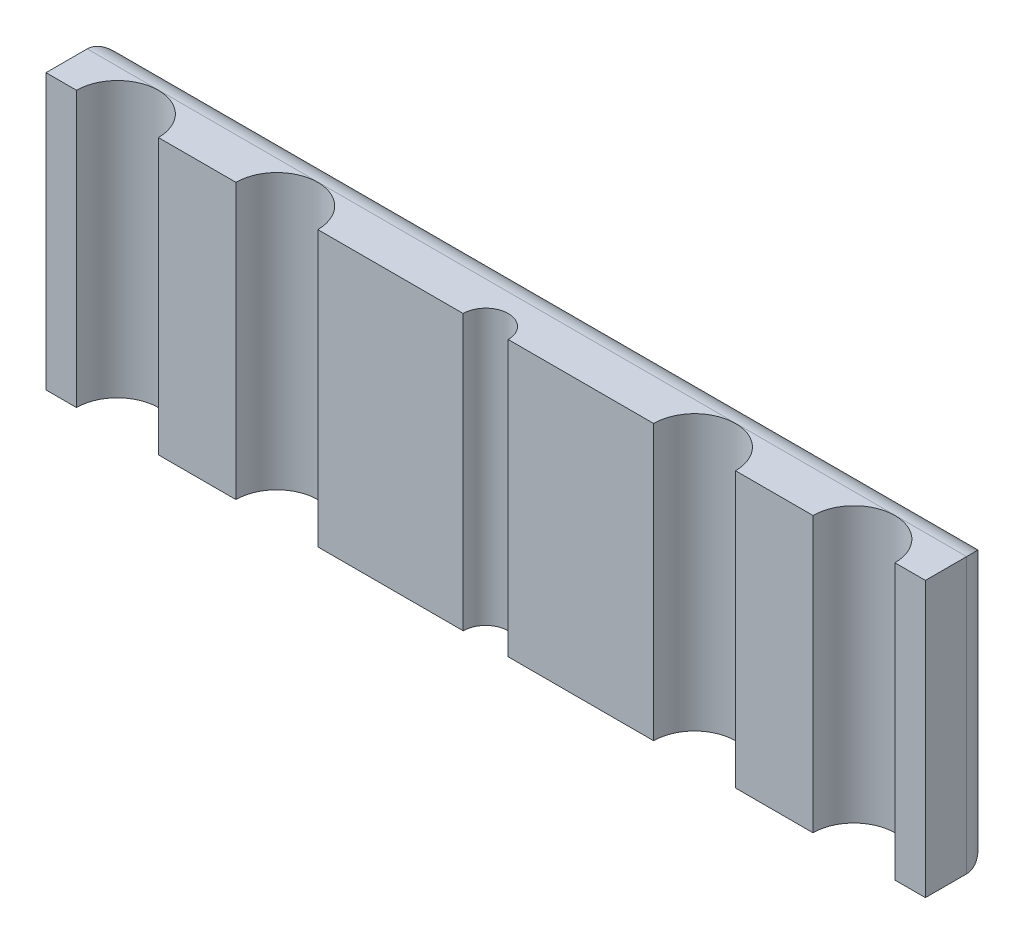
ISO-10303-21;
HEADER;
FILE_DESCRIPTION(('STEP AP214'),'2;1');
FILE_NAME('part.step','',(''),(''),'','','');
FILE_SCHEMA(('AUTOMOTIVE_DESIGN { 1 0 10303 214 1 1 1 1 }'));
ENDSEC;
DATA;
#1=APPLICATION_CONTEXT('core data for automotive mechanical design processes');
#2=APPLICATION_PROTOCOL_DEFINITION('international standard','automotive_design',2000,#1);
#3=PRODUCT_CONTEXT('',#1,'mechanical');
#4=PRODUCT('Part','Part','',(#3));
#5=PRODUCT_RELATED_PRODUCT_CATEGORY('part','',(#4));
#6=PRODUCT_DEFINITION_FORMATION('','',#4);
#7=PRODUCT_DEFINITION_CONTEXT('part definition',#1,'design');
#8=PRODUCT_DEFINITION('design','',#6,#7);
#9=PRODUCT_DEFINITION_SHAPE('','',#8);
#10=(LENGTH_UNIT() NAMED_UNIT(*) SI_UNIT(.MILLI.,.METRE.));
#11=(NAMED_UNIT(*) PLANE_ANGLE_UNIT() SI_UNIT($,.RADIAN.));
#12=(NAMED_UNIT(*) SI_UNIT($,.STERADIAN.) SOLID_ANGLE_UNIT());
#13=UNCERTAINTY_MEASURE_WITH_UNIT(LENGTH_MEASURE(1.E-05),#10,'distance_accuracy_value','');
#14=(GEOMETRIC_REPRESENTATION_CONTEXT(3) GLOBAL_UNCERTAINTY_ASSIGNED_CONTEXT((#13)) GLOBAL_UNIT_ASSIGNED_CONTEXT((#10,
#11,#12)) REPRESENTATION_CONTEXT('',''));
#15=CARTESIAN_POINT('',(0.,0.,0.));
#16=DIRECTION('',(0.,0.,1.));
#17=DIRECTION('',(1.,0.,0.));
#18=AXIS2_PLACEMENT_3D('',#15,#16,#17);
#19=CARTESIAN_POINT('',(0.,0.,12.5));
#20=DIRECTION('',(0.,0.,-1.));
#21=DIRECTION('',(-1.,0.,0.));
#22=AXIS2_PLACEMENT_3D('',#19,#20,#21);
#23=PLANE('',#22);
#24=DIRECTION('',(1.,0.,0.));
#25=VECTOR('',#24,1.);
#26=CARTESIAN_POINT('',(0.,-50.,12.5));
#27=LINE('',#26,#25);
#28=CARTESIAN_POINT('',(-160.,-50.,12.5));
#29=VERTEX_POINT('',#28);
#30=CARTESIAN_POINT('',(-154.45,-50.,12.5));
#31=VERTEX_POINT('',#30);
#32=EDGE_CURVE('E203',#29,#31,#27,.T.);
#33=ORIENTED_EDGE('',*,*,#32,.T.);
#34=DIRECTION('',(0.,1.,0.));
#35=VECTOR('',#34,1.);
#36=CARTESIAN_POINT('',(-154.45,-50.,12.5));
#37=LINE('',#36,#35);
#38=CARTESIAN_POINT('',(-154.45,0.,12.5));
#39=VERTEX_POINT('',#38);
#40=EDGE_CURVE('E248',#31,#39,#37,.T.);
#41=ORIENTED_EDGE('',*,*,#40,.T.);
#42=DIRECTION('',(-1.,0.,0.));
#43=VECTOR('',#42,1.);
#44=CARTESIAN_POINT('',(0.,0.,12.5));
#45=LINE('',#44,#43);
#46=CARTESIAN_POINT('',(-160.,0.,12.5));
#47=VERTEX_POINT('',#46);
#48=EDGE_CURVE('E191',#39,#47,#45,.T.);
#49=ORIENTED_EDGE('',*,*,#48,.T.);
#50=DIRECTION('',(0.,-1.,0.));
#51=VECTOR('',#50,1.);
#52=CARTESIAN_POINT('',(-160.,0.,12.5));
#53=LINE('',#52,#51);
#54=EDGE_CURVE('E197',#47,#29,#53,.T.);
#55=ORIENTED_EDGE('',*,*,#54,.T.);
#56=EDGE_LOOP('',(#33,#41,#49,#55));
#57=FACE_BOUND('',#56,.T.);
#58=ADVANCED_FACE('F39',(#57),#23,.F.);
#59=CARTESIAN_POINT('',(-110.55,-50.,12.5));
#60=VERTEX_POINT('',#59);
#61=CARTESIAN_POINT('',(-84.1,-50.,12.5));
#62=VERTEX_POINT('',#61);
#63=EDGE_CURVE('E383',#60,#62,#27,.T.);
#64=ORIENTED_EDGE('',*,*,#63,.T.);
#65=DIRECTION('',(0.,1.,0.));
#66=VECTOR('',#65,1.);
#67=CARTESIAN_POINT('',(-84.1,-50.,12.5));
#68=LINE('',#67,#66);
#69=CARTESIAN_POINT('',(-84.1,0.,12.5));
#70=VERTEX_POINT('',#69);
#71=EDGE_CURVE('E183',#62,#70,#68,.T.);
#72=ORIENTED_EDGE('',*,*,#71,.T.);
#73=CARTESIAN_POINT('',(-110.55,0.,12.5));
#74=VERTEX_POINT('',#73);
#75=EDGE_CURVE('E174',#70,#74,#45,.T.);
#76=ORIENTED_EDGE('',*,*,#75,.T.);
#77=DIRECTION('',(0.,1.,0.));
#78=VECTOR('',#77,1.);
#79=CARTESIAN_POINT('',(-110.55,-50.,12.5));
#80=LINE('',#79,#78);
#81=EDGE_CURVE('E155',#74,#60,#80,.F.);
#82=ORIENTED_EDGE('',*,*,#81,.T.);
#83=EDGE_LOOP('',(#64,#72,#76,#82));
#84=FACE_BOUND('',#83,.T.);
#85=ADVANCED_FACE('F182',(#84),#23,.F.);
#86=CARTESIAN_POINT('',(-49.45,0.,12.5));
#87=VERTEX_POINT('',#86);
#88=CARTESIAN_POINT('',(-75.9,0.,12.5));
#89=VERTEX_POINT('',#88);
#90=EDGE_CURVE('E185',#87,#89,#45,.T.);
#91=ORIENTED_EDGE('',*,*,#90,.T.);
#92=DIRECTION('',(0.,1.,0.));
#93=VECTOR('',#92,1.);
#94=CARTESIAN_POINT('',(-75.9,-50.,12.5));
#95=LINE('',#94,#93);
#96=CARTESIAN_POINT('',(-75.9,-50.,12.5));
#97=VERTEX_POINT('',#96);
#98=EDGE_CURVE('E238',#89,#97,#95,.F.);
#99=ORIENTED_EDGE('',*,*,#98,.T.);
#100=CARTESIAN_POINT('',(-49.45,-50.,12.5));
#101=VERTEX_POINT('',#100);
#102=EDGE_CURVE('E380',#97,#101,#27,.T.);
#103=ORIENTED_EDGE('',*,*,#102,.T.);
#104=DIRECTION('',(0.,1.,0.));
#105=VECTOR('',#104,1.);
#106=CARTESIAN_POINT('',(-49.45,-50.,12.5));
#107=LINE('',#106,#105);
#108=EDGE_CURVE('E234',#101,#87,#107,.T.);
#109=ORIENTED_EDGE('',*,*,#108,.T.);
#110=EDGE_LOOP('',(#91,#99,#103,#109));
#111=FACE_BOUND('',#110,.T.);
#112=ADVANCED_FACE('F354',(#111),#23,.F.);
#113=CARTESIAN_POINT('',(-20.45,0.,12.5));
#114=VERTEX_POINT('',#113);
#115=CARTESIAN_POINT('',(-34.55,0.,12.5));
#116=VERTEX_POINT('',#115);
#117=EDGE_CURVE('E190',#114,#116,#45,.T.);
#118=ORIENTED_EDGE('',*,*,#117,.T.);
#119=DIRECTION('',(0.,1.,0.));
#120=VECTOR('',#119,1.);
#121=CARTESIAN_POINT('',(-34.55,-50.,12.5));
#122=LINE('',#121,#120);
#123=CARTESIAN_POINT('',(-34.55,-50.,12.5));
#124=VERTEX_POINT('',#123);
#125=EDGE_CURVE('E230',#116,#124,#122,.F.);
#126=ORIENTED_EDGE('',*,*,#125,.T.);
#127=CARTESIAN_POINT('',(-20.45,-50.,12.5));
#128=VERTEX_POINT('',#127);
#129=EDGE_CURVE('E378',#124,#128,#27,.T.);
#130=ORIENTED_EDGE('',*,*,#129,.T.);
#131=DIRECTION('',(0.,1.,0.));
#132=VECTOR('',#131,1.);
#133=CARTESIAN_POINT('',(-20.45,-50.,12.5));
#134=LINE('',#133,#132);
#135=EDGE_CURVE('E226',#128,#114,#134,.T.);
#136=ORIENTED_EDGE('',*,*,#135,.T.);
#137=EDGE_LOOP('',(#118,#126,#130,#136));
#138=FACE_BOUND('',#137,.T.);
#139=ADVANCED_FACE('F394',(#138),#23,.F.);
#140=CARTESIAN_POINT('',(-125.45,0.,12.5));
#141=VERTEX_POINT('',#140);
#142=CARTESIAN_POINT('',(-139.55,0.,12.5));
#143=VERTEX_POINT('',#142);
#144=EDGE_CURVE('E177',#141,#143,#45,.T.);
#145=ORIENTED_EDGE('',*,*,#144,.T.);
#146=DIRECTION('',(0.,1.,0.));
#147=VECTOR('',#146,1.);
#148=CARTESIAN_POINT('',(-139.55,-50.,12.5));
#149=LINE('',#148,#147);
#150=CARTESIAN_POINT('',(-139.55,-50.,12.5));
#151=VERTEX_POINT('',#150);
#152=EDGE_CURVE('E244',#143,#151,#149,.F.);
#153=ORIENTED_EDGE('',*,*,#152,.T.);
#154=CARTESIAN_POINT('',(-125.45,-50.,12.5));
#155=VERTEX_POINT('',#154);
#156=EDGE_CURVE('E208',#151,#155,#27,.T.);
#157=ORIENTED_EDGE('',*,*,#156,.T.);
#158=DIRECTION('',(0.,1.,0.));
#159=VECTOR('',#158,1.);
#160=CARTESIAN_POINT('',(-125.45,-50.,12.5));
#161=LINE('',#160,#159);
#162=EDGE_CURVE('E167',#155,#141,#161,.T.);
#163=ORIENTED_EDGE('',*,*,#162,.T.);
#164=EDGE_LOOP('',(#145,#153,#157,#163));
#165=FACE_BOUND('',#164,.T.);
#166=ADVANCED_FACE('F347',(#165),#23,.F.);
#167=CARTESIAN_POINT('',(0.,0.,12.5));
#168=DIRECTION('',(-1.,0.,0.));
#169=DIRECTION('',(0.,-1.,0.));
#170=AXIS2_PLACEMENT_3D('',#167,#168,#169);
#171=PLANE('',#170);
#172=DIRECTION('',(0.,0.,-1.));
#173=VECTOR('',#172,1.);
#174=CARTESIAN_POINT('',(0.,-50.,12.5));
#175=LINE('',#174,#173);
#176=CARTESIAN_POINT('',(0.,-50.,12.5));
#177=VERTEX_POINT('',#176);
#178=CARTESIAN_POINT('',(0.,-50.,5.));
#179=VERTEX_POINT('',#178);
#180=EDGE_CURVE('E207',#177,#179,#175,.T.);
#181=ORIENTED_EDGE('',*,*,#180,.T.);
#182=DIRECTION('',(0.,1.,0.));
#183=VECTOR('',#182,1.);
#184=CARTESIAN_POINT('',(0.,0.,5.));
#185=LINE('',#184,#183);
#186=CARTESIAN_POINT('',(0.,0.,5.));
#187=VERTEX_POINT('',#186);
#188=EDGE_CURVE('E252',#179,#187,#185,.T.);
#189=ORIENTED_EDGE('',*,*,#188,.T.);
#190=DIRECTION('',(0.,0.,-1.));
#191=VECTOR('',#190,1.);
#192=CARTESIAN_POINT('',(0.,0.,12.5));
#193=LINE('',#192,#191);
#194=CARTESIAN_POINT('',(0.,0.,12.5));
#195=VERTEX_POINT('',#194);
#196=EDGE_CURVE('E168',#195,#187,#193,.T.);
#197=ORIENTED_EDGE('',*,*,#196,.F.);
#198=DIRECTION('',(0.,1.,0.));
#199=VECTOR('',#198,1.);
#200=CARTESIAN_POINT('',(0.,0.,12.5));
#201=LINE('',#200,#199);
#202=EDGE_CURVE('E198',#177,#195,#201,.T.);
#203=ORIENTED_EDGE('',*,*,#202,.F.);
#204=EDGE_LOOP('',(#181,#189,#197,#203));
#205=FACE_BOUND('',#204,.T.);
#206=ADVANCED_FACE('F372',(#205),#171,.F.);
#207=CARTESIAN_POINT('',(0.,0.,12.5));
#208=DIRECTION('',(0.,-1.,0.));
#209=DIRECTION('',(0.,0.,-1.));
#210=AXIS2_PLACEMENT_3D('',#207,#208,#209);
#211=PLANE('',#210);
#212=ORIENTED_EDGE('',*,*,#196,.T.);
#213=DIRECTION('',(-1.,0.,0.));
#214=VECTOR('',#213,1.);
#215=CARTESIAN_POINT('',(-160.,0.,5.));
#216=LINE('',#215,#214);
#217=CARTESIAN_POINT('',(-160.,0.,5.));
#218=VERTEX_POINT('',#217);
#219=EDGE_CURVE('E63',#187,#218,#216,.T.);
#220=ORIENTED_EDGE('',*,*,#219,.T.);
#221=DIRECTION('',(0.,0.,-1.));
#222=VECTOR('',#221,1.);
#223=CARTESIAN_POINT('',(-160.,0.,12.5));
#224=LINE('',#223,#222);
#225=EDGE_CURVE('E215',#47,#218,#224,.T.);
#226=ORIENTED_EDGE('',*,*,#225,.F.);
#227=ORIENTED_EDGE('',*,*,#48,.F.);
#228=CARTESIAN_POINT('',(-147.,0.,12.5));
#229=DIRECTION('',(0.,1.,0.));
#230=DIRECTION('',(0.,0.,1.));
#231=AXIS2_PLACEMENT_3D('',#228,#229,#230);
#232=CIRCLE('',#231,7.45000000000002);
#233=EDGE_CURVE('E302',#143,#39,#232,.T.);
#234=ORIENTED_EDGE('',*,*,#233,.F.);
#235=ORIENTED_EDGE('',*,*,#144,.F.);
#236=CARTESIAN_POINT('',(-118.,0.,12.5));
#237=DIRECTION('',(0.,1.,0.));
#238=DIRECTION('',(0.,0.,1.));
#239=AXIS2_PLACEMENT_3D('',#236,#237,#238);
#240=CIRCLE('',#239,7.45);
#241=EDGE_CURVE('E158',#74,#141,#240,.T.);
#242=ORIENTED_EDGE('',*,*,#241,.F.);
#243=ORIENTED_EDGE('',*,*,#75,.F.);
#244=CARTESIAN_POINT('',(-80.,0.,12.5));
#245=DIRECTION('',(0.,1.,0.));
#246=DIRECTION('',(0.,0.,1.));
#247=AXIS2_PLACEMENT_3D('',#244,#245,#246);
#248=CIRCLE('',#247,4.1);
#249=EDGE_CURVE('E286',#89,#70,#248,.T.);
#250=ORIENTED_EDGE('',*,*,#249,.F.);
#251=ORIENTED_EDGE('',*,*,#90,.F.);
#252=CARTESIAN_POINT('',(-42.,0.,12.5));
#253=DIRECTION('',(0.,1.,0.));
#254=DIRECTION('',(0.,0.,1.));
#255=AXIS2_PLACEMENT_3D('',#252,#253,#254);
#256=CIRCLE('',#255,7.44999999999999);
#257=EDGE_CURVE('E297',#116,#87,#256,.T.);
#258=ORIENTED_EDGE('',*,*,#257,.F.);
#259=ORIENTED_EDGE('',*,*,#117,.F.);
#260=CARTESIAN_POINT('',(-13.,0.,12.5));
#261=DIRECTION('',(0.,1.,0.));
#262=DIRECTION('',(0.,0.,1.));
#263=AXIS2_PLACEMENT_3D('',#260,#261,#262);
#264=CIRCLE('',#263,7.45);
#265=CARTESIAN_POINT('',(-5.55,0.,12.5));
#266=VERTEX_POINT('',#265);
#267=EDGE_CURVE('E306',#266,#114,#264,.T.);
#268=ORIENTED_EDGE('',*,*,#267,.F.);
#269=EDGE_CURVE('E192',#195,#266,#45,.T.);
#270=ORIENTED_EDGE('',*,*,#269,.F.);
#271=EDGE_LOOP('',(#212,#220,#226,#227,#234,#235,#242,#243,#250,#251,#258,#259,#268,#270));
#272=FACE_BOUND('',#271,.T.);
#273=ADVANCED_FACE('F172',(#272),#211,.F.);
#274=CARTESIAN_POINT('',(-160.,0.,12.5));
#275=DIRECTION('',(1.,0.,0.));
#276=DIRECTION('',(0.,0.,-1.));
#277=AXIS2_PLACEMENT_3D('',#274,#275,#276);
#278=PLANE('',#277);
#279=ORIENTED_EDGE('',*,*,#225,.T.);
#280=DIRECTION('',(0.,-1.,0.));
#281=VECTOR('',#280,1.);
#282=CARTESIAN_POINT('',(-160.,-50.,5.));
#283=LINE('',#282,#281);
#284=CARTESIAN_POINT('',(-160.,-50.,5.));
#285=VERTEX_POINT('',#284);
#286=EDGE_CURVE('E11',#218,#285,#283,.T.);
#287=ORIENTED_EDGE('',*,*,#286,.T.);
#288=DIRECTION('',(0.,0.,-1.));
#289=VECTOR('',#288,1.);
#290=CARTESIAN_POINT('',(-160.,-50.,12.5));
#291=LINE('',#290,#289);
#292=EDGE_CURVE('E212',#29,#285,#291,.T.);
#293=ORIENTED_EDGE('',*,*,#292,.F.);
#294=ORIENTED_EDGE('',*,*,#54,.F.);
#295=EDGE_LOOP('',(#279,#287,#293,#294));
#296=FACE_BOUND('',#295,.T.);
#297=ADVANCED_FACE('F336',(#296),#278,.F.);
#298=CARTESIAN_POINT('',(0.,-50.,12.5));
#299=DIRECTION('',(0.,1.,0.));
#300=DIRECTION('',(-1.,0.,0.));
#301=AXIS2_PLACEMENT_3D('',#298,#299,#300);
#302=PLANE('',#301);
#303=ORIENTED_EDGE('',*,*,#292,.T.);
#304=DIRECTION('',(1.,0.,0.));
#305=VECTOR('',#304,1.);
#306=CARTESIAN_POINT('',(0.,-50.,5.));
#307=LINE('',#306,#305);
#308=EDGE_CURVE('E49',#285,#179,#307,.T.);
#309=ORIENTED_EDGE('',*,*,#308,.T.);
#310=ORIENTED_EDGE('',*,*,#180,.F.);
#311=CARTESIAN_POINT('',(-5.55,-50.,12.5));
#312=VERTEX_POINT('',#311);
#313=EDGE_CURVE('E202',#312,#177,#27,.T.);
#314=ORIENTED_EDGE('',*,*,#313,.F.);
#315=CARTESIAN_POINT('',(-13.,-50.,12.5));
#316=DIRECTION('',(0.,1.,0.));
#317=DIRECTION('',(0.,0.,1.));
#318=AXIS2_PLACEMENT_3D('',#315,#316,#317);
#319=CIRCLE('',#318,7.45);
#320=EDGE_CURVE('E179',#312,#128,#319,.T.);
#321=ORIENTED_EDGE('',*,*,#320,.T.);
#322=ORIENTED_EDGE('',*,*,#129,.F.);
#323=CARTESIAN_POINT('',(-42.,-50.,12.5));
#324=DIRECTION('',(0.,1.,0.));
#325=DIRECTION('',(0.,0.,1.));
#326=AXIS2_PLACEMENT_3D('',#323,#324,#325);
#327=CIRCLE('',#326,7.44999999999999);
#328=EDGE_CURVE('E308',#124,#101,#327,.T.);
#329=ORIENTED_EDGE('',*,*,#328,.T.);
#330=ORIENTED_EDGE('',*,*,#102,.F.);
#331=CARTESIAN_POINT('',(-80.,-50.,12.5));
#332=DIRECTION('',(0.,1.,0.));
#333=DIRECTION('',(0.,0.,1.));
#334=AXIS2_PLACEMENT_3D('',#331,#332,#333);
#335=CIRCLE('',#334,4.1);
#336=EDGE_CURVE('E292',#97,#62,#335,.T.);
#337=ORIENTED_EDGE('',*,*,#336,.T.);
#338=ORIENTED_EDGE('',*,*,#63,.F.);
#339=CARTESIAN_POINT('',(-118.,-50.,12.5));
#340=DIRECTION('',(0.,1.,0.));
#341=DIRECTION('',(0.,0.,1.));
#342=AXIS2_PLACEMENT_3D('',#339,#340,#341);
#343=CIRCLE('',#342,7.45);
#344=EDGE_CURVE('E161',#60,#155,#343,.T.);
#345=ORIENTED_EDGE('',*,*,#344,.T.);
#346=ORIENTED_EDGE('',*,*,#156,.F.);
#347=CARTESIAN_POINT('',(-147.,-50.,12.5));
#348=DIRECTION('',(0.,1.,0.));
#349=DIRECTION('',(0.,0.,1.));
#350=AXIS2_PLACEMENT_3D('',#347,#348,#349);
#351=CIRCLE('',#350,7.45000000000002);
#352=EDGE_CURVE('E322',#151,#31,#351,.T.);
#353=ORIENTED_EDGE('',*,*,#352,.T.);
#354=ORIENTED_EDGE('',*,*,#32,.F.);
#355=EDGE_LOOP('',(#303,#309,#310,#314,#321,#322,#329,#330,#337,#338,#345,#346,#353,#354));
#356=FACE_BOUND('',#355,.T.);
#357=ADVANCED_FACE('F337',(#356),#302,.F.);
#358=ORIENTED_EDGE('',*,*,#269,.T.);
#359=DIRECTION('',(0.,1.,0.));
#360=VECTOR('',#359,1.);
#361=CARTESIAN_POINT('',(-5.55,-50.,12.5));
#362=LINE('',#361,#360);
#363=EDGE_CURVE('E222',#266,#312,#362,.F.);
#364=ORIENTED_EDGE('',*,*,#363,.T.);
#365=ORIENTED_EDGE('',*,*,#313,.T.);
#366=ORIENTED_EDGE('',*,*,#202,.T.);
#367=EDGE_LOOP('',(#358,#364,#365,#366));
#368=FACE_BOUND('',#367,.T.);
#369=ADVANCED_FACE('F339',(#368),#23,.F.);
#370=CARTESIAN_POINT('',(0.,0.,0.));
#371=DIRECTION('',(0.,0.,-1.));
#372=DIRECTION('',(-1.,0.,0.));
#373=AXIS2_PLACEMENT_3D('',#370,#371,#372);
#374=PLANE('',#373);
#375=DIRECTION('',(-1.,0.,0.));
#376=VECTOR('',#375,1.);
#377=CARTESIAN_POINT('',(0.,-5.,0.));
#378=LINE('',#377,#376);
#379=CARTESIAN_POINT('',(-155.,-5.,0.));
#380=VERTEX_POINT('',#379);
#381=CARTESIAN_POINT('',(-5.,-5.,0.));
#382=VERTEX_POINT('',#381);
#383=EDGE_CURVE('E262',#380,#382,#378,.F.);
#384=ORIENTED_EDGE('',*,*,#383,.T.);
#385=DIRECTION('',(0.,1.,0.));
#386=VECTOR('',#385,1.);
#387=CARTESIAN_POINT('',(-4.99999999999999,-50.,0.));
#388=LINE('',#387,#386);
#389=CARTESIAN_POINT('',(-4.99999999999999,-45.,0.));
#390=VERTEX_POINT('',#389);
#391=EDGE_CURVE('E265',#382,#390,#388,.F.);
#392=ORIENTED_EDGE('',*,*,#391,.T.);
#393=DIRECTION('',(1.,0.,0.));
#394=VECTOR('',#393,1.);
#395=CARTESIAN_POINT('',(-160.,-45.,0.));
#396=LINE('',#395,#394);
#397=CARTESIAN_POINT('',(-155.,-45.,0.));
#398=VERTEX_POINT('',#397);
#399=EDGE_CURVE('E259',#390,#398,#396,.F.);
#400=ORIENTED_EDGE('',*,*,#399,.T.);
#401=DIRECTION('',(0.,-1.,0.));
#402=VECTOR('',#401,1.);
#403=CARTESIAN_POINT('',(-155.,0.,0.));
#404=LINE('',#403,#402);
#405=EDGE_CURVE('E256',#398,#380,#404,.F.);
#406=ORIENTED_EDGE('',*,*,#405,.T.);
#407=EDGE_LOOP('',(#384,#392,#400,#406));
#408=FACE_BOUND('',#407,.T.);
#409=ADVANCED_FACE('F345',(#408),#374,.T.);
#410=CARTESIAN_POINT('',(-118.,-50.,12.5));
#411=DIRECTION('',(0.,1.,0.));
#412=DIRECTION('',(0.,0.,1.));
#413=AXIS2_PLACEMENT_3D('',#410,#411,#412);
#414=CYLINDRICAL_SURFACE('',#413,7.45);
#415=ORIENTED_EDGE('',*,*,#344,.F.);
#416=ORIENTED_EDGE('',*,*,#81,.F.);
#417=ORIENTED_EDGE('',*,*,#241,.T.);
#418=ORIENTED_EDGE('',*,*,#162,.F.);
#419=EDGE_LOOP('',(#415,#416,#417,#418));
#420=FACE_BOUND('',#419,.T.);
#421=ADVANCED_FACE('F157',(#420),#414,.F.);
#422=CARTESIAN_POINT('',(-13.,-50.,12.5));
#423=DIRECTION('',(0.,1.,0.));
#424=DIRECTION('',(0.,0.,1.));
#425=AXIS2_PLACEMENT_3D('',#422,#423,#424);
#426=CYLINDRICAL_SURFACE('',#425,7.45);
#427=ORIENTED_EDGE('',*,*,#320,.F.);
#428=ORIENTED_EDGE('',*,*,#363,.F.);
#429=ORIENTED_EDGE('',*,*,#267,.T.);
#430=ORIENTED_EDGE('',*,*,#135,.F.);
#431=EDGE_LOOP('',(#427,#428,#429,#430));
#432=FACE_BOUND('',#431,.T.);
#433=ADVANCED_FACE('F356',(#432),#426,.F.);
#434=CARTESIAN_POINT('',(-42.,-50.,12.5));
#435=DIRECTION('',(0.,1.,0.));
#436=DIRECTION('',(0.,0.,1.));
#437=AXIS2_PLACEMENT_3D('',#434,#435,#436);
#438=CYLINDRICAL_SURFACE('',#437,7.44999999999999);
#439=ORIENTED_EDGE('',*,*,#328,.F.);
#440=ORIENTED_EDGE('',*,*,#125,.F.);
#441=ORIENTED_EDGE('',*,*,#257,.T.);
#442=ORIENTED_EDGE('',*,*,#108,.F.);
#443=EDGE_LOOP('',(#439,#440,#441,#442));
#444=FACE_BOUND('',#443,.T.);
#445=ADVANCED_FACE('F397',(#444),#438,.F.);
#446=CARTESIAN_POINT('',(-80.,-50.,12.5));
#447=DIRECTION('',(0.,1.,0.));
#448=DIRECTION('',(0.,0.,1.));
#449=AXIS2_PLACEMENT_3D('',#446,#447,#448);
#450=CYLINDRICAL_SURFACE('',#449,4.1);
#451=ORIENTED_EDGE('',*,*,#336,.F.);
#452=ORIENTED_EDGE('',*,*,#98,.F.);
#453=ORIENTED_EDGE('',*,*,#249,.T.);
#454=ORIENTED_EDGE('',*,*,#71,.F.);
#455=EDGE_LOOP('',(#451,#452,#453,#454));
#456=FACE_BOUND('',#455,.T.);
#457=ADVANCED_FACE('F389',(#456),#450,.F.);
#458=CARTESIAN_POINT('',(-147.,-50.,12.5));
#459=DIRECTION('',(0.,1.,0.));
#460=DIRECTION('',(0.,0.,1.));
#461=AXIS2_PLACEMENT_3D('',#458,#459,#460);
#462=CYLINDRICAL_SURFACE('',#461,7.45000000000002);
#463=ORIENTED_EDGE('',*,*,#352,.F.);
#464=ORIENTED_EDGE('',*,*,#152,.F.);
#465=ORIENTED_EDGE('',*,*,#233,.T.);
#466=ORIENTED_EDGE('',*,*,#40,.F.);
#467=EDGE_LOOP('',(#463,#464,#465,#466));
#468=FACE_BOUND('',#467,.T.);
#469=ADVANCED_FACE('F405',(#468),#462,.F.);
#470=CARTESIAN_POINT('',(-155.,0.,5.));
#471=DIRECTION('',(0.,1.,0.));
#472=DIRECTION('',(0.,0.,1.));
#473=AXIS2_PLACEMENT_3D('',#470,#471,#472);
#474=CYLINDRICAL_SURFACE('',#473,5.);
#475=CARTESIAN_POINT('',(-155.,-5.,5.));
#476=DIRECTION('',(0.707106781186547,0.707106781186547,0.));
#477=DIRECTION('',(-0.707106781186547,0.707106781186547,0.));
#478=AXIS2_PLACEMENT_3D('',#475,#476,#477);
#479=ELLIPSE('',#478,7.07106781186547,5.);
#480=EDGE_CURVE('E278',#380,#218,#479,.T.);
#481=ORIENTED_EDGE('',*,*,#480,.F.);
#482=ORIENTED_EDGE('',*,*,#405,.F.);
#483=CARTESIAN_POINT('',(-155.,-45.,5.));
#484=DIRECTION('',(-0.707106781186548,0.707106781186547,0.));
#485=DIRECTION('',(0.707106781186547,0.707106781186548,0.));
#486=AXIS2_PLACEMENT_3D('',#483,#484,#485);
#487=ELLIPSE('',#486,7.07106781186548,5.);
#488=EDGE_CURVE('E43',#285,#398,#487,.F.);
#489=ORIENTED_EDGE('',*,*,#488,.F.);
#490=ORIENTED_EDGE('',*,*,#286,.F.);
#491=EDGE_LOOP('',(#481,#482,#489,#490));
#492=FACE_BOUND('',#491,.T.);
#493=ADVANCED_FACE('F41',(#492),#474,.T.);
#494=CARTESIAN_POINT('',(0.,-45.,5.));
#495=DIRECTION('',(-1.,0.,0.));
#496=DIRECTION('',(0.,-1.,0.));
#497=AXIS2_PLACEMENT_3D('',#494,#495,#496);
#498=CYLINDRICAL_SURFACE('',#497,5.);
#499=ORIENTED_EDGE('',*,*,#488,.T.);
#500=ORIENTED_EDGE('',*,*,#399,.F.);
#501=CARTESIAN_POINT('',(-4.99999999999999,-45.,5.));
#502=DIRECTION('',(-0.707106781186547,-0.707106781186548,0.));
#503=DIRECTION('',(-0.707106781186548,0.707106781186547,0.));
#504=AXIS2_PLACEMENT_3D('',#501,#502,#503);
#505=ELLIPSE('',#504,7.07106781186547,5.);
#506=EDGE_CURVE('E276',#179,#390,#505,.F.);
#507=ORIENTED_EDGE('',*,*,#506,.F.);
#508=ORIENTED_EDGE('',*,*,#308,.F.);
#509=EDGE_LOOP('',(#499,#500,#507,#508));
#510=FACE_BOUND('',#509,.T.);
#511=ADVANCED_FACE('F413',(#510),#498,.T.);
#512=CARTESIAN_POINT('',(0.,-5.,5.));
#513=DIRECTION('',(1.,0.,0.));
#514=DIRECTION('',(0.,0.,-1.));
#515=AXIS2_PLACEMENT_3D('',#512,#513,#514);
#516=CYLINDRICAL_SURFACE('',#515,5.);
#517=ORIENTED_EDGE('',*,*,#480,.T.);
#518=ORIENTED_EDGE('',*,*,#219,.F.);
#519=CARTESIAN_POINT('',(-5.,-5.,5.));
#520=DIRECTION('',(0.707106781186548,-0.707106781186547,0.));
#521=DIRECTION('',(0.707106781186547,0.707106781186548,0.));
#522=AXIS2_PLACEMENT_3D('',#519,#520,#521);
#523=ELLIPSE('',#522,7.07106781186547,5.);
#524=EDGE_CURVE('E273',#382,#187,#523,.T.);
#525=ORIENTED_EDGE('',*,*,#524,.F.);
#526=ORIENTED_EDGE('',*,*,#383,.F.);
#527=EDGE_LOOP('',(#517,#518,#525,#526));
#528=FACE_BOUND('',#527,.T.);
#529=ADVANCED_FACE('F370',(#528),#516,.T.);
#530=CARTESIAN_POINT('',(-5.,0.,5.));
#531=DIRECTION('',(0.,-1.,0.));
#532=DIRECTION('',(1.,0.,0.));
#533=AXIS2_PLACEMENT_3D('',#530,#531,#532);
#534=CYLINDRICAL_SURFACE('',#533,5.);
#535=ORIENTED_EDGE('',*,*,#506,.T.);
#536=ORIENTED_EDGE('',*,*,#391,.F.);
#537=ORIENTED_EDGE('',*,*,#524,.T.);
#538=ORIENTED_EDGE('',*,*,#188,.F.);
#539=EDGE_LOOP('',(#535,#536,#537,#538));
#540=FACE_BOUND('',#539,.T.);
#541=ADVANCED_FACE('F367',(#540),#534,.T.);
#542=CLOSED_SHELL('',(#58,#85,#112,#139,#166,#206,#273,#297,#357,#369,#409,#421,#433,#445,#457,
#469,#493,#511,#529,#541));
#543=MANIFOLD_SOLID_BREP('B2',#542);
#544=ADVANCED_BREP_SHAPE_REPRESENTATION('',(#18,#543),#14);
#545=SHAPE_DEFINITION_REPRESENTATION(#9,#544);
ENDSEC;
END-ISO-10303-21;
